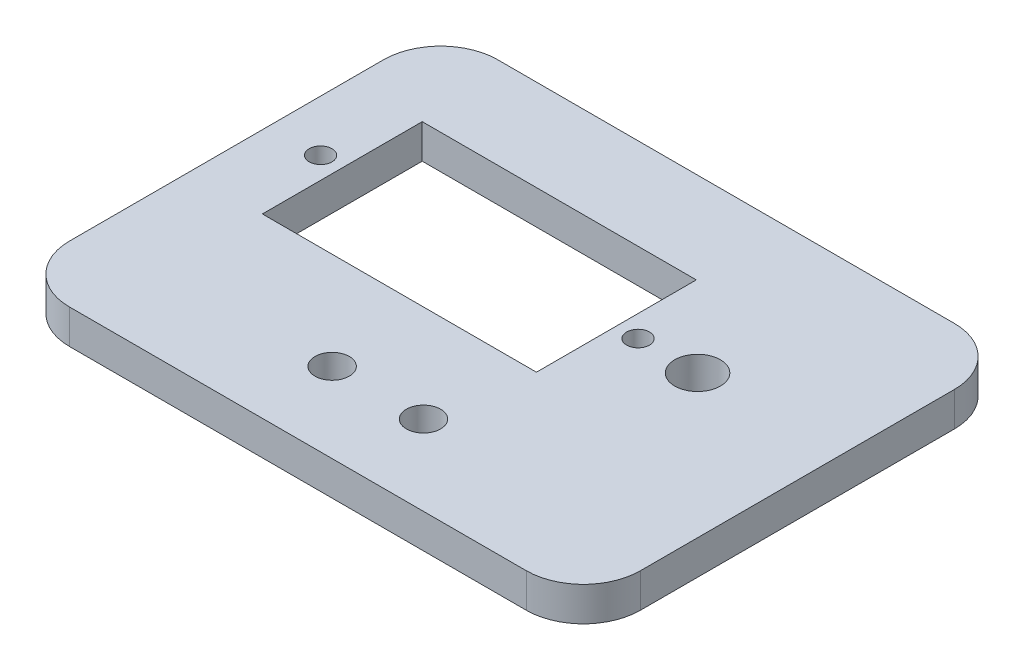
ISO-10303-21;
HEADER;
FILE_DESCRIPTION(('STEP AP214'),'2;1');
FILE_NAME('part.step','',(''),(''),'','','');
FILE_SCHEMA(('AUTOMOTIVE_DESIGN { 1 0 10303 214 1 1 1 1 }'));
ENDSEC;
DATA;
#1=APPLICATION_CONTEXT('core data for automotive mechanical design processes');
#2=APPLICATION_PROTOCOL_DEFINITION('international standard','automotive_design',2000,#1);
#3=PRODUCT_CONTEXT('',#1,'mechanical');
#4=PRODUCT('Part','Part','',(#3));
#5=PRODUCT_RELATED_PRODUCT_CATEGORY('part','',(#4));
#6=PRODUCT_DEFINITION_FORMATION('','',#4);
#7=PRODUCT_DEFINITION_CONTEXT('part definition',#1,'design');
#8=PRODUCT_DEFINITION('design','',#6,#7);
#9=PRODUCT_DEFINITION_SHAPE('','',#8);
#10=(LENGTH_UNIT() NAMED_UNIT(*) SI_UNIT(.MILLI.,.METRE.));
#11=(NAMED_UNIT(*) PLANE_ANGLE_UNIT() SI_UNIT($,.RADIAN.));
#12=(NAMED_UNIT(*) SI_UNIT($,.STERADIAN.) SOLID_ANGLE_UNIT());
#13=UNCERTAINTY_MEASURE_WITH_UNIT(LENGTH_MEASURE(1.E-05),#10,'distance_accuracy_value','');
#14=(GEOMETRIC_REPRESENTATION_CONTEXT(3) GLOBAL_UNCERTAINTY_ASSIGNED_CONTEXT((#13)) GLOBAL_UNIT_ASSIGNED_CONTEXT((#10,
#11,#12)) REPRESENTATION_CONTEXT('',''));
#15=CARTESIAN_POINT('',(0.,0.,0.));
#16=DIRECTION('',(0.,0.,1.));
#17=DIRECTION('',(1.,0.,0.));
#18=AXIS2_PLACEMENT_3D('',#15,#16,#17);
#19=CARTESIAN_POINT('',(0.,3.,0.));
#20=DIRECTION('',(0.,-1.,0.));
#21=DIRECTION('',(0.,0.,-1.));
#22=AXIS2_PLACEMENT_3D('',#19,#20,#21);
#23=PLANE('',#22);
#24=CARTESIAN_POINT('',(12.5,3.,-3.75000000000001));
#25=DIRECTION('',(0.,1.,0.));
#26=DIRECTION('',(0.,0.,1.));
#27=AXIS2_PLACEMENT_3D('',#24,#25,#26);
#28=CIRCLE('',#27,2.);
#29=CARTESIAN_POINT('',(12.5,3.,-1.75000000000001));
#30=VERTEX_POINT('',#29);
#31=EDGE_CURVE('E545',#30,#30,#28,.T.);
#32=ORIENTED_EDGE('',*,*,#31,.F.);
#33=EDGE_LOOP('',(#32));
#34=FACE_BOUND('',#33,.T.);
#35=CARTESIAN_POINT('',(-4.00000000000001,3.,11.75));
#36=DIRECTION('',(0.,1.,0.));
#37=DIRECTION('',(0.,0.,-1.));
#38=AXIS2_PLACEMENT_3D('',#35,#36,#37);
#39=CIRCLE('',#38,1.5);
#40=CARTESIAN_POINT('',(-4.00000000000001,3.,10.25));
#41=VERTEX_POINT('',#40);
#42=EDGE_CURVE('E191',#41,#41,#39,.T.);
#43=ORIENTED_EDGE('',*,*,#42,.F.);
#44=EDGE_LOOP('',(#43));
#45=FACE_BOUND('',#44,.T.);
#46=CARTESIAN_POINT('',(3.99999999999999,3.,11.75));
#47=DIRECTION('',(0.,1.,0.));
#48=DIRECTION('',(0.,0.,1.));
#49=AXIS2_PLACEMENT_3D('',#46,#47,#48);
#50=CIRCLE('',#49,1.5);
#51=CARTESIAN_POINT('',(3.99999999999999,3.,13.25));
#52=VERTEX_POINT('',#51);
#53=EDGE_CURVE('E199',#52,#52,#50,.T.);
#54=ORIENTED_EDGE('',*,*,#53,.F.);
#55=EDGE_LOOP('',(#54));
#56=FACE_BOUND('',#55,.T.);
#57=DIRECTION('',(-1.,0.,0.));
#58=VECTOR('',#57,1.);
#59=CARTESIAN_POINT('',(-25.,3.,-18.75));
#60=LINE('',#59,#58);
#61=CARTESIAN_POINT('',(20.,3.,-18.75));
#62=VERTEX_POINT('',#61);
#63=CARTESIAN_POINT('',(-20.,3.,-18.75));
#64=VERTEX_POINT('',#63);
#65=EDGE_CURVE('E211',#62,#64,#60,.T.);
#66=ORIENTED_EDGE('',*,*,#65,.T.);
#67=CARTESIAN_POINT('',(-20.,3.,-13.75));
#68=DIRECTION('',(0.,-1.,0.));
#69=DIRECTION('',(0.,0.,-1.));
#70=AXIS2_PLACEMENT_3D('',#67,#68,#69);
#71=CIRCLE('',#70,5.);
#72=CARTESIAN_POINT('',(-25.,3.,-13.75));
#73=VERTEX_POINT('',#72);
#74=EDGE_CURVE('E269',#64,#73,#71,.F.);
#75=ORIENTED_EDGE('',*,*,#74,.T.);
#76=DIRECTION('',(0.,0.,1.));
#77=VECTOR('',#76,1.);
#78=CARTESIAN_POINT('',(-25.,3.,18.75));
#79=LINE('',#78,#77);
#80=CARTESIAN_POINT('',(-25.,3.,13.75));
#81=VERTEX_POINT('',#80);
#82=EDGE_CURVE('E216',#73,#81,#79,.T.);
#83=ORIENTED_EDGE('',*,*,#82,.T.);
#84=CARTESIAN_POINT('',(-20.,3.,13.75));
#85=DIRECTION('',(0.,-1.,0.));
#86=DIRECTION('',(0.,0.,-1.));
#87=AXIS2_PLACEMENT_3D('',#84,#85,#86);
#88=CIRCLE('',#87,5.);
#89=CARTESIAN_POINT('',(-20.,3.,18.75));
#90=VERTEX_POINT('',#89);
#91=EDGE_CURVE('E65',#81,#90,#88,.F.);
#92=ORIENTED_EDGE('',*,*,#91,.T.);
#93=DIRECTION('',(1.,0.,0.));
#94=VECTOR('',#93,1.);
#95=CARTESIAN_POINT('',(-25.,3.,18.75));
#96=LINE('',#95,#94);
#97=CARTESIAN_POINT('',(20.,3.,18.75));
#98=VERTEX_POINT('',#97);
#99=EDGE_CURVE('E219',#90,#98,#96,.T.);
#100=ORIENTED_EDGE('',*,*,#99,.T.);
#101=CARTESIAN_POINT('',(20.,3.,13.75));
#102=DIRECTION('',(0.,-1.,0.));
#103=DIRECTION('',(0.,0.,-1.));
#104=AXIS2_PLACEMENT_3D('',#101,#102,#103);
#105=CIRCLE('',#104,5.);
#106=CARTESIAN_POINT('',(25.,3.,13.75));
#107=VERTEX_POINT('',#106);
#108=EDGE_CURVE('E263',#98,#107,#105,.F.);
#109=ORIENTED_EDGE('',*,*,#108,.T.);
#110=DIRECTION('',(0.,0.,-1.));
#111=VECTOR('',#110,1.);
#112=CARTESIAN_POINT('',(25.,3.,18.75));
#113=LINE('',#112,#111);
#114=CARTESIAN_POINT('',(25.,3.,-13.75));
#115=VERTEX_POINT('',#114);
#116=EDGE_CURVE('E207',#107,#115,#113,.T.);
#117=ORIENTED_EDGE('',*,*,#116,.T.);
#118=CARTESIAN_POINT('',(20.,3.,-13.75));
#119=DIRECTION('',(0.,-1.,0.));
#120=DIRECTION('',(0.,0.,-1.));
#121=AXIS2_PLACEMENT_3D('',#118,#119,#120);
#122=CIRCLE('',#121,5.);
#123=EDGE_CURVE('E266',#115,#62,#122,.F.);
#124=ORIENTED_EDGE('',*,*,#123,.T.);
#125=EDGE_LOOP('',(#66,#75,#83,#92,#100,#109,#117,#124));
#126=FACE_BOUND('',#125,.T.);
#127=DIRECTION('',(0.,0.,-1.));
#128=VECTOR('',#127,1.);
#129=CARTESIAN_POINT('',(5.39,3.,3.24999999999999));
#130=LINE('',#129,#128);
#131=CARTESIAN_POINT('',(5.39,3.,3.24999999999999));
#132=VERTEX_POINT('',#131);
#133=CARTESIAN_POINT('',(5.39,3.,-10.75));
#134=VERTEX_POINT('',#133);
#135=EDGE_CURVE('E135',#132,#134,#130,.T.);
#136=ORIENTED_EDGE('',*,*,#135,.F.);
#137=DIRECTION('',(1.,0.,0.));
#138=VECTOR('',#137,1.);
#139=CARTESIAN_POINT('',(-18.61,3.,3.24999999999999));
#140=LINE('',#139,#138);
#141=CARTESIAN_POINT('',(-18.61,3.,3.24999999999999));
#142=VERTEX_POINT('',#141);
#143=EDGE_CURVE('E165',#142,#132,#140,.T.);
#144=ORIENTED_EDGE('',*,*,#143,.F.);
#145=DIRECTION('',(0.,0.,1.));
#146=VECTOR('',#145,1.);
#147=CARTESIAN_POINT('',(-18.61,3.,3.24999999999999));
#148=LINE('',#147,#146);
#149=CARTESIAN_POINT('',(-18.61,3.,-10.75));
#150=VERTEX_POINT('',#149);
#151=EDGE_CURVE('E161',#150,#142,#148,.T.);
#152=ORIENTED_EDGE('',*,*,#151,.F.);
#153=DIRECTION('',(-1.,0.,0.));
#154=VECTOR('',#153,1.);
#155=CARTESIAN_POINT('',(-18.61,3.,-10.75));
#156=LINE('',#155,#154);
#157=EDGE_CURVE('E146',#134,#150,#156,.T.);
#158=ORIENTED_EDGE('',*,*,#157,.F.);
#159=EDGE_LOOP('',(#136,#144,#152,#158));
#160=FACE_BOUND('',#159,.T.);
#161=CARTESIAN_POINT('',(7.29,3.,-3.75000000000001));
#162=DIRECTION('',(0.,1.,0.));
#163=DIRECTION('',(0.,0.,1.));
#164=AXIS2_PLACEMENT_3D('',#161,#162,#163);
#165=CIRCLE('',#164,1.);
#166=CARTESIAN_POINT('',(7.29,3.,-2.75000000000001));
#167=VERTEX_POINT('',#166);
#168=EDGE_CURVE('E174',#167,#167,#165,.T.);
#169=ORIENTED_EDGE('',*,*,#168,.F.);
#170=EDGE_LOOP('',(#169));
#171=FACE_BOUND('',#170,.T.);
#172=CARTESIAN_POINT('',(-20.51,3.,-3.75000000000001));
#173=DIRECTION('',(0.,1.,0.));
#174=DIRECTION('',(0.,0.,-1.));
#175=AXIS2_PLACEMENT_3D('',#172,#173,#174);
#176=CIRCLE('',#175,1.);
#177=CARTESIAN_POINT('',(-20.51,3.,-4.75000000000001));
#178=VERTEX_POINT('',#177);
#179=EDGE_CURVE('E537',#178,#178,#176,.T.);
#180=ORIENTED_EDGE('',*,*,#179,.F.);
#181=EDGE_LOOP('',(#180));
#182=FACE_BOUND('',#181,.T.);
#183=ADVANCED_FACE('F43',(#34,#45,#56,#126,#160,#171,#182),#23,.F.);
#184=CARTESIAN_POINT('',(0.,0.,0.));
#185=DIRECTION('',(0.,-1.,0.));
#186=DIRECTION('',(0.,0.,-1.));
#187=AXIS2_PLACEMENT_3D('',#184,#185,#186);
#188=PLANE('',#187);
#189=CARTESIAN_POINT('',(12.5,0.,-3.75000000000001));
#190=DIRECTION('',(0.,-1.,0.));
#191=DIRECTION('',(0.,0.,-1.));
#192=AXIS2_PLACEMENT_3D('',#189,#190,#191);
#193=CIRCLE('',#192,2.);
#194=CARTESIAN_POINT('',(12.5,0.,-5.75));
#195=VERTEX_POINT('',#194);
#196=EDGE_CURVE('E47',#195,#195,#193,.T.);
#197=ORIENTED_EDGE('',*,*,#196,.F.);
#198=EDGE_LOOP('',(#197));
#199=FACE_BOUND('',#198,.T.);
#200=CARTESIAN_POINT('',(7.29,0.,-3.75000000000001));
#201=DIRECTION('',(0.,1.,0.));
#202=DIRECTION('',(0.,0.,1.));
#203=AXIS2_PLACEMENT_3D('',#200,#201,#202);
#204=CIRCLE('',#203,1.);
#205=CARTESIAN_POINT('',(7.29,0.,-2.75000000000001));
#206=VERTEX_POINT('',#205);
#207=EDGE_CURVE('E542',#206,#206,#204,.T.);
#208=ORIENTED_EDGE('',*,*,#207,.T.);
#209=EDGE_LOOP('',(#208));
#210=FACE_BOUND('',#209,.T.);
#211=CARTESIAN_POINT('',(3.99999999999999,0.,11.75));
#212=DIRECTION('',(0.,1.,0.));
#213=DIRECTION('',(0.,0.,1.));
#214=AXIS2_PLACEMENT_3D('',#211,#212,#213);
#215=CIRCLE('',#214,1.5);
#216=CARTESIAN_POINT('',(3.99999999999999,0.,13.25));
#217=VERTEX_POINT('',#216);
#218=EDGE_CURVE('E195',#217,#217,#215,.T.);
#219=ORIENTED_EDGE('',*,*,#218,.T.);
#220=EDGE_LOOP('',(#219));
#221=FACE_BOUND('',#220,.T.);
#222=DIRECTION('',(0.,0.,1.));
#223=VECTOR('',#222,1.);
#224=CARTESIAN_POINT('',(-25.,0.,18.75));
#225=LINE('',#224,#223);
#226=CARTESIAN_POINT('',(-25.,0.,-13.75));
#227=VERTEX_POINT('',#226);
#228=CARTESIAN_POINT('',(-25.,0.,13.75));
#229=VERTEX_POINT('',#228);
#230=EDGE_CURVE('E230',#227,#229,#225,.T.);
#231=ORIENTED_EDGE('',*,*,#230,.F.);
#232=CARTESIAN_POINT('',(-20.,0.,-13.75));
#233=DIRECTION('',(0.,-1.,0.));
#234=DIRECTION('',(0.,0.,-1.));
#235=AXIS2_PLACEMENT_3D('',#232,#233,#234);
#236=CIRCLE('',#235,5.);
#237=CARTESIAN_POINT('',(-20.,0.,-18.75));
#238=VERTEX_POINT('',#237);
#239=EDGE_CURVE('E251',#227,#238,#236,.T.);
#240=ORIENTED_EDGE('',*,*,#239,.T.);
#241=DIRECTION('',(-1.,0.,0.));
#242=VECTOR('',#241,1.);
#243=CARTESIAN_POINT('',(-25.,0.,-18.75));
#244=LINE('',#243,#242);
#245=CARTESIAN_POINT('',(20.,0.,-18.75));
#246=VERTEX_POINT('',#245);
#247=EDGE_CURVE('E226',#246,#238,#244,.T.);
#248=ORIENTED_EDGE('',*,*,#247,.F.);
#249=CARTESIAN_POINT('',(20.,0.,-13.75));
#250=DIRECTION('',(0.,-1.,0.));
#251=DIRECTION('',(0.,0.,-1.));
#252=AXIS2_PLACEMENT_3D('',#249,#250,#251);
#253=CIRCLE('',#252,5.);
#254=CARTESIAN_POINT('',(25.,0.,-13.75));
#255=VERTEX_POINT('',#254);
#256=EDGE_CURVE('E248',#246,#255,#253,.T.);
#257=ORIENTED_EDGE('',*,*,#256,.T.);
#258=DIRECTION('',(0.,0.,-1.));
#259=VECTOR('',#258,1.);
#260=CARTESIAN_POINT('',(25.,0.,18.75));
#261=LINE('',#260,#259);
#262=CARTESIAN_POINT('',(25.,0.,13.75));
#263=VERTEX_POINT('',#262);
#264=EDGE_CURVE('E203',#263,#255,#261,.T.);
#265=ORIENTED_EDGE('',*,*,#264,.F.);
#266=CARTESIAN_POINT('',(20.,0.,13.75));
#267=DIRECTION('',(0.,-1.,0.));
#268=DIRECTION('',(0.,0.,-1.));
#269=AXIS2_PLACEMENT_3D('',#266,#267,#268);
#270=CIRCLE('',#269,5.);
#271=CARTESIAN_POINT('',(20.,0.,18.75));
#272=VERTEX_POINT('',#271);
#273=EDGE_CURVE('E245',#263,#272,#270,.T.);
#274=ORIENTED_EDGE('',*,*,#273,.T.);
#275=DIRECTION('',(1.,0.,0.));
#276=VECTOR('',#275,1.);
#277=CARTESIAN_POINT('',(-25.,0.,18.75));
#278=LINE('',#277,#276);
#279=CARTESIAN_POINT('',(-20.,0.,18.75));
#280=VERTEX_POINT('',#279);
#281=EDGE_CURVE('E212',#280,#272,#278,.T.);
#282=ORIENTED_EDGE('',*,*,#281,.F.);
#283=CARTESIAN_POINT('',(-20.,0.,13.75));
#284=DIRECTION('',(0.,-1.,0.));
#285=DIRECTION('',(0.,0.,-1.));
#286=AXIS2_PLACEMENT_3D('',#283,#284,#285);
#287=CIRCLE('',#286,5.);
#288=EDGE_CURVE('E242',#280,#229,#287,.T.);
#289=ORIENTED_EDGE('',*,*,#288,.T.);
#290=EDGE_LOOP('',(#231,#240,#248,#257,#265,#274,#282,#289));
#291=FACE_BOUND('',#290,.T.);
#292=CARTESIAN_POINT('',(-4.00000000000001,0.,11.75));
#293=DIRECTION('',(0.,1.,0.));
#294=DIRECTION('',(0.,0.,-1.));
#295=AXIS2_PLACEMENT_3D('',#292,#293,#294);
#296=CIRCLE('',#295,1.5);
#297=CARTESIAN_POINT('',(-4.00000000000001,0.,10.25));
#298=VERTEX_POINT('',#297);
#299=EDGE_CURVE('E155',#298,#298,#296,.T.);
#300=ORIENTED_EDGE('',*,*,#299,.T.);
#301=EDGE_LOOP('',(#300));
#302=FACE_BOUND('',#301,.T.);
#303=DIRECTION('',(1.,0.,0.));
#304=VECTOR('',#303,1.);
#305=CARTESIAN_POINT('',(-18.61,0.,3.24999999999999));
#306=LINE('',#305,#304);
#307=CARTESIAN_POINT('',(-18.61,0.,3.24999999999999));
#308=VERTEX_POINT('',#307);
#309=CARTESIAN_POINT('',(5.39,0.,3.24999999999999));
#310=VERTEX_POINT('',#309);
#311=EDGE_CURVE('E147',#308,#310,#306,.T.);
#312=ORIENTED_EDGE('',*,*,#311,.T.);
#313=DIRECTION('',(0.,0.,-1.));
#314=VECTOR('',#313,1.);
#315=CARTESIAN_POINT('',(5.39,0.,3.24999999999999));
#316=LINE('',#315,#314);
#317=CARTESIAN_POINT('',(5.39,0.,-10.75));
#318=VERTEX_POINT('',#317);
#319=EDGE_CURVE('E171',#310,#318,#316,.T.);
#320=ORIENTED_EDGE('',*,*,#319,.T.);
#321=DIRECTION('',(-1.,0.,0.));
#322=VECTOR('',#321,1.);
#323=CARTESIAN_POINT('',(-18.61,0.,-10.75));
#324=LINE('',#323,#322);
#325=CARTESIAN_POINT('',(-18.61,0.,-10.75));
#326=VERTEX_POINT('',#325);
#327=EDGE_CURVE('E153',#318,#326,#324,.T.);
#328=ORIENTED_EDGE('',*,*,#327,.T.);
#329=DIRECTION('',(0.,0.,1.));
#330=VECTOR('',#329,1.);
#331=CARTESIAN_POINT('',(-18.61,0.,3.24999999999999));
#332=LINE('',#331,#330);
#333=EDGE_CURVE('E177',#326,#308,#332,.T.);
#334=ORIENTED_EDGE('',*,*,#333,.T.);
#335=EDGE_LOOP('',(#312,#320,#328,#334));
#336=FACE_BOUND('',#335,.T.);
#337=CARTESIAN_POINT('',(-20.51,0.,-3.75000000000001));
#338=DIRECTION('',(0.,1.,0.));
#339=DIRECTION('',(0.,0.,-1.));
#340=AXIS2_PLACEMENT_3D('',#337,#338,#339);
#341=CIRCLE('',#340,1.);
#342=CARTESIAN_POINT('',(-20.51,0.,-4.75000000000001));
#343=VERTEX_POINT('',#342);
#344=EDGE_CURVE('E534',#343,#343,#341,.T.);
#345=ORIENTED_EDGE('',*,*,#344,.T.);
#346=EDGE_LOOP('',(#345));
#347=FACE_BOUND('',#346,.T.);
#348=ADVANCED_FACE('F287',(#199,#210,#221,#291,#302,#336,#347),#188,.T.);
#349=CARTESIAN_POINT('',(25.,3.,18.75));
#350=DIRECTION('',(-1.,0.,0.));
#351=DIRECTION('',(0.,0.,1.));
#352=AXIS2_PLACEMENT_3D('',#349,#350,#351);
#353=PLANE('',#352);
#354=ORIENTED_EDGE('',*,*,#264,.T.);
#355=DIRECTION('',(0.,-1.,0.));
#356=VECTOR('',#355,1.);
#357=CARTESIAN_POINT('',(25.,3.,-13.75));
#358=LINE('',#357,#356);
#359=EDGE_CURVE('E276',#255,#115,#358,.F.);
#360=ORIENTED_EDGE('',*,*,#359,.T.);
#361=ORIENTED_EDGE('',*,*,#116,.F.);
#362=DIRECTION('',(0.,-1.,0.));
#363=VECTOR('',#362,1.);
#364=CARTESIAN_POINT('',(25.,3.,13.75));
#365=LINE('',#364,#363);
#366=EDGE_CURVE('E272',#107,#263,#365,.T.);
#367=ORIENTED_EDGE('',*,*,#366,.T.);
#368=EDGE_LOOP('',(#354,#360,#361,#367));
#369=FACE_BOUND('',#368,.T.);
#370=ADVANCED_FACE('F296',(#369),#353,.F.);
#371=CARTESIAN_POINT('',(-25.,3.,-18.75));
#372=DIRECTION('',(0.,0.,1.));
#373=DIRECTION('',(1.,0.,0.));
#374=AXIS2_PLACEMENT_3D('',#371,#372,#373);
#375=PLANE('',#374);
#376=ORIENTED_EDGE('',*,*,#247,.T.);
#377=DIRECTION('',(0.,-1.,0.));
#378=VECTOR('',#377,1.);
#379=CARTESIAN_POINT('',(-20.,3.,-18.75));
#380=LINE('',#379,#378);
#381=EDGE_CURVE('E258',#238,#64,#380,.F.);
#382=ORIENTED_EDGE('',*,*,#381,.T.);
#383=ORIENTED_EDGE('',*,*,#65,.F.);
#384=DIRECTION('',(0.,-1.,0.));
#385=VECTOR('',#384,1.);
#386=CARTESIAN_POINT('',(20.,3.,-18.75));
#387=LINE('',#386,#385);
#388=EDGE_CURVE('E254',#62,#246,#387,.T.);
#389=ORIENTED_EDGE('',*,*,#388,.T.);
#390=EDGE_LOOP('',(#376,#382,#383,#389));
#391=FACE_BOUND('',#390,.T.);
#392=ADVANCED_FACE('F305',(#391),#375,.F.);
#393=CARTESIAN_POINT('',(-25.,3.,18.75));
#394=DIRECTION('',(1.,0.,0.));
#395=DIRECTION('',(0.,0.,-1.));
#396=AXIS2_PLACEMENT_3D('',#393,#394,#395);
#397=PLANE('',#396);
#398=ORIENTED_EDGE('',*,*,#82,.F.);
#399=DIRECTION('',(0.,-1.,0.));
#400=VECTOR('',#399,1.);
#401=CARTESIAN_POINT('',(-25.,3.,-13.75));
#402=LINE('',#401,#400);
#403=EDGE_CURVE('E238',#73,#227,#402,.T.);
#404=ORIENTED_EDGE('',*,*,#403,.T.);
#405=ORIENTED_EDGE('',*,*,#230,.T.);
#406=DIRECTION('',(0.,-1.,0.));
#407=VECTOR('',#406,1.);
#408=CARTESIAN_POINT('',(-25.,3.,13.75));
#409=LINE('',#408,#407);
#410=EDGE_CURVE('E222',#229,#81,#409,.F.);
#411=ORIENTED_EDGE('',*,*,#410,.T.);
#412=EDGE_LOOP('',(#398,#404,#405,#411));
#413=FACE_BOUND('',#412,.T.);
#414=ADVANCED_FACE('F313',(#413),#397,.F.);
#415=CARTESIAN_POINT('',(-25.,3.,18.75));
#416=DIRECTION('',(0.,0.,-1.));
#417=DIRECTION('',(-1.,0.,0.));
#418=AXIS2_PLACEMENT_3D('',#415,#416,#417);
#419=PLANE('',#418);
#420=ORIENTED_EDGE('',*,*,#281,.T.);
#421=DIRECTION('',(0.,-1.,0.));
#422=VECTOR('',#421,1.);
#423=CARTESIAN_POINT('',(20.,3.,18.75));
#424=LINE('',#423,#422);
#425=EDGE_CURVE('E11',#272,#98,#424,.F.);
#426=ORIENTED_EDGE('',*,*,#425,.T.);
#427=ORIENTED_EDGE('',*,*,#99,.F.);
#428=DIRECTION('',(0.,-1.,0.));
#429=VECTOR('',#428,1.);
#430=CARTESIAN_POINT('',(-20.,3.,18.75));
#431=LINE('',#430,#429);
#432=EDGE_CURVE('E53',#90,#280,#431,.T.);
#433=ORIENTED_EDGE('',*,*,#432,.T.);
#434=EDGE_LOOP('',(#420,#426,#427,#433));
#435=FACE_BOUND('',#434,.T.);
#436=ADVANCED_FACE('F283',(#435),#419,.F.);
#437=CARTESIAN_POINT('',(3.99999999999999,3.,11.75));
#438=DIRECTION('',(0.,-1.,0.));
#439=DIRECTION('',(0.,0.,-1.));
#440=AXIS2_PLACEMENT_3D('',#437,#438,#439);
#441=CYLINDRICAL_SURFACE('',#440,1.5);
#442=ORIENTED_EDGE('',*,*,#53,.T.);
#443=EDGE_LOOP('',(#442));
#444=FACE_BOUND('',#443,.T.);
#445=ORIENTED_EDGE('',*,*,#218,.F.);
#446=EDGE_LOOP('',(#445));
#447=FACE_BOUND('',#446,.T.);
#448=ADVANCED_FACE('F334',(#444,#447),#441,.F.);
#449=CARTESIAN_POINT('',(-4.00000000000001,3.,11.75));
#450=DIRECTION('',(0.,-1.,0.));
#451=DIRECTION('',(0.,0.,-1.));
#452=AXIS2_PLACEMENT_3D('',#449,#450,#451);
#453=CYLINDRICAL_SURFACE('',#452,1.5);
#454=ORIENTED_EDGE('',*,*,#42,.T.);
#455=EDGE_LOOP('',(#454));
#456=FACE_BOUND('',#455,.T.);
#457=ORIENTED_EDGE('',*,*,#299,.F.);
#458=EDGE_LOOP('',(#457));
#459=FACE_BOUND('',#458,.T.);
#460=ADVANCED_FACE('F451',(#456,#459),#453,.F.);
#461=CARTESIAN_POINT('',(5.39,3.,3.24999999999999));
#462=DIRECTION('',(-1.,0.,0.));
#463=DIRECTION('',(0.,0.,1.));
#464=AXIS2_PLACEMENT_3D('',#461,#462,#463);
#465=PLANE('',#464);
#466=ORIENTED_EDGE('',*,*,#319,.F.);
#467=DIRECTION('',(0.,-1.,0.));
#468=VECTOR('',#467,1.);
#469=CARTESIAN_POINT('',(5.39,3.,3.24999999999999));
#470=LINE('',#469,#468);
#471=EDGE_CURVE('E141',#132,#310,#470,.T.);
#472=ORIENTED_EDGE('',*,*,#471,.F.);
#473=ORIENTED_EDGE('',*,*,#135,.T.);
#474=DIRECTION('',(0.,-1.,0.));
#475=VECTOR('',#474,1.);
#476=CARTESIAN_POINT('',(5.39,3.,-10.75));
#477=LINE('',#476,#475);
#478=EDGE_CURVE('E138',#134,#318,#477,.T.);
#479=ORIENTED_EDGE('',*,*,#478,.T.);
#480=EDGE_LOOP('',(#466,#472,#473,#479));
#481=FACE_BOUND('',#480,.T.);
#482=ADVANCED_FACE('F137',(#481),#465,.T.);
#483=CARTESIAN_POINT('',(-18.61,3.,-10.75));
#484=DIRECTION('',(0.,0.,1.));
#485=DIRECTION('',(1.,0.,0.));
#486=AXIS2_PLACEMENT_3D('',#483,#484,#485);
#487=PLANE('',#486);
#488=ORIENTED_EDGE('',*,*,#327,.F.);
#489=ORIENTED_EDGE('',*,*,#478,.F.);
#490=ORIENTED_EDGE('',*,*,#157,.T.);
#491=DIRECTION('',(0.,-1.,0.));
#492=VECTOR('',#491,1.);
#493=CARTESIAN_POINT('',(-18.61,3.,-10.75));
#494=LINE('',#493,#492);
#495=EDGE_CURVE('E156',#150,#326,#494,.T.);
#496=ORIENTED_EDGE('',*,*,#495,.T.);
#497=EDGE_LOOP('',(#488,#489,#490,#496));
#498=FACE_BOUND('',#497,.T.);
#499=ADVANCED_FACE('F150',(#498),#487,.T.);
#500=CARTESIAN_POINT('',(-18.61,3.,3.24999999999999));
#501=DIRECTION('',(1.,0.,0.));
#502=DIRECTION('',(0.,0.,-1.));
#503=AXIS2_PLACEMENT_3D('',#500,#501,#502);
#504=PLANE('',#503);
#505=ORIENTED_EDGE('',*,*,#333,.F.);
#506=ORIENTED_EDGE('',*,*,#495,.F.);
#507=ORIENTED_EDGE('',*,*,#151,.T.);
#508=DIRECTION('',(0.,-1.,0.));
#509=VECTOR('',#508,1.);
#510=CARTESIAN_POINT('',(-18.61,3.,3.24999999999999));
#511=LINE('',#510,#509);
#512=EDGE_CURVE('E186',#142,#308,#511,.T.);
#513=ORIENTED_EDGE('',*,*,#512,.T.);
#514=EDGE_LOOP('',(#505,#506,#507,#513));
#515=FACE_BOUND('',#514,.T.);
#516=ADVANCED_FACE('F424',(#515),#504,.T.);
#517=CARTESIAN_POINT('',(-18.61,3.,3.24999999999999));
#518=DIRECTION('',(0.,0.,-1.));
#519=DIRECTION('',(-1.,0.,0.));
#520=AXIS2_PLACEMENT_3D('',#517,#518,#519);
#521=PLANE('',#520);
#522=ORIENTED_EDGE('',*,*,#311,.F.);
#523=ORIENTED_EDGE('',*,*,#512,.F.);
#524=ORIENTED_EDGE('',*,*,#143,.T.);
#525=ORIENTED_EDGE('',*,*,#471,.T.);
#526=EDGE_LOOP('',(#522,#523,#524,#525));
#527=FACE_BOUND('',#526,.T.);
#528=ADVANCED_FACE('F414',(#527),#521,.T.);
#529=CARTESIAN_POINT('',(7.29,3.,-3.75000000000001));
#530=DIRECTION('',(0.,-1.,0.));
#531=DIRECTION('',(0.,0.,-1.));
#532=AXIS2_PLACEMENT_3D('',#529,#530,#531);
#533=CYLINDRICAL_SURFACE('',#532,1.);
#534=ORIENTED_EDGE('',*,*,#168,.T.);
#535=EDGE_LOOP('',(#534));
#536=FACE_BOUND('',#535,.T.);
#537=ORIENTED_EDGE('',*,*,#207,.F.);
#538=EDGE_LOOP('',(#537));
#539=FACE_BOUND('',#538,.T.);
#540=ADVANCED_FACE('F404',(#536,#539),#533,.F.);
#541=CARTESIAN_POINT('',(-20.51,3.,-3.75000000000001));
#542=DIRECTION('',(0.,-1.,0.));
#543=DIRECTION('',(0.,0.,-1.));
#544=AXIS2_PLACEMENT_3D('',#541,#542,#543);
#545=CYLINDRICAL_SURFACE('',#544,1.);
#546=ORIENTED_EDGE('',*,*,#179,.T.);
#547=EDGE_LOOP('',(#546));
#548=FACE_BOUND('',#547,.T.);
#549=ORIENTED_EDGE('',*,*,#344,.F.);
#550=EDGE_LOOP('',(#549));
#551=FACE_BOUND('',#550,.T.);
#552=ADVANCED_FACE('F347',(#548,#551),#545,.F.);
#553=CARTESIAN_POINT('',(-20.,3.,-13.75));
#554=DIRECTION('',(0.,-1.,0.));
#555=DIRECTION('',(0.,0.,-1.));
#556=AXIS2_PLACEMENT_3D('',#553,#554,#555);
#557=CYLINDRICAL_SURFACE('',#556,5.);
#558=ORIENTED_EDGE('',*,*,#74,.F.);
#559=ORIENTED_EDGE('',*,*,#381,.F.);
#560=ORIENTED_EDGE('',*,*,#239,.F.);
#561=ORIENTED_EDGE('',*,*,#403,.F.);
#562=EDGE_LOOP('',(#558,#559,#560,#561));
#563=FACE_BOUND('',#562,.T.);
#564=ADVANCED_FACE('F310',(#563),#557,.T.);
#565=CARTESIAN_POINT('',(20.,3.,-13.75));
#566=DIRECTION('',(0.,-1.,0.));
#567=DIRECTION('',(0.,0.,-1.));
#568=AXIS2_PLACEMENT_3D('',#565,#566,#567);
#569=CYLINDRICAL_SURFACE('',#568,5.);
#570=ORIENTED_EDGE('',*,*,#123,.F.);
#571=ORIENTED_EDGE('',*,*,#359,.F.);
#572=ORIENTED_EDGE('',*,*,#256,.F.);
#573=ORIENTED_EDGE('',*,*,#388,.F.);
#574=EDGE_LOOP('',(#570,#571,#572,#573));
#575=FACE_BOUND('',#574,.T.);
#576=ADVANCED_FACE('F302',(#575),#569,.T.);
#577=CARTESIAN_POINT('',(20.,3.,13.75));
#578=DIRECTION('',(0.,-1.,0.));
#579=DIRECTION('',(0.,0.,-1.));
#580=AXIS2_PLACEMENT_3D('',#577,#578,#579);
#581=CYLINDRICAL_SURFACE('',#580,5.);
#582=ORIENTED_EDGE('',*,*,#108,.F.);
#583=ORIENTED_EDGE('',*,*,#425,.F.);
#584=ORIENTED_EDGE('',*,*,#273,.F.);
#585=ORIENTED_EDGE('',*,*,#366,.F.);
#586=EDGE_LOOP('',(#582,#583,#584,#585));
#587=FACE_BOUND('',#586,.T.);
#588=ADVANCED_FACE('F293',(#587),#581,.T.);
#589=CARTESIAN_POINT('',(-20.,3.,13.75));
#590=DIRECTION('',(0.,-1.,0.));
#591=DIRECTION('',(0.,0.,-1.));
#592=AXIS2_PLACEMENT_3D('',#589,#590,#591);
#593=CYLINDRICAL_SURFACE('',#592,5.);
#594=ORIENTED_EDGE('',*,*,#91,.F.);
#595=ORIENTED_EDGE('',*,*,#410,.F.);
#596=ORIENTED_EDGE('',*,*,#288,.F.);
#597=ORIENTED_EDGE('',*,*,#432,.F.);
#598=EDGE_LOOP('',(#594,#595,#596,#597));
#599=FACE_BOUND('',#598,.T.);
#600=ADVANCED_FACE('F45',(#599),#593,.T.);
#601=CARTESIAN_POINT('',(12.5,-7.,-3.75000000000001));
#602=DIRECTION('',(0.,1.,0.));
#603=DIRECTION('',(0.,0.,1.));
#604=AXIS2_PLACEMENT_3D('',#601,#602,#603);
#605=CYLINDRICAL_SURFACE('',#604,2.);
#606=ORIENTED_EDGE('',*,*,#196,.T.);
#607=EDGE_LOOP('',(#606));
#608=FACE_BOUND('',#607,.T.);
#609=ORIENTED_EDGE('',*,*,#31,.T.);
#610=EDGE_LOOP('',(#609));
#611=FACE_BOUND('',#610,.T.);
#612=ADVANCED_FACE('F316',(#608,#611),#605,.F.);
#613=CLOSED_SHELL('',(#183,#348,#370,#392,#414,#436,#448,#460,#482,#499,#516,#528,#540,#552,
#564,#576,#588,#600,#612));
#614=MANIFOLD_SOLID_BREP('B2',#613);
#615=ADVANCED_BREP_SHAPE_REPRESENTATION('',(#18,#614),#14);
#616=SHAPE_DEFINITION_REPRESENTATION(#9,#615);
ENDSEC;
END-ISO-10303-21;
